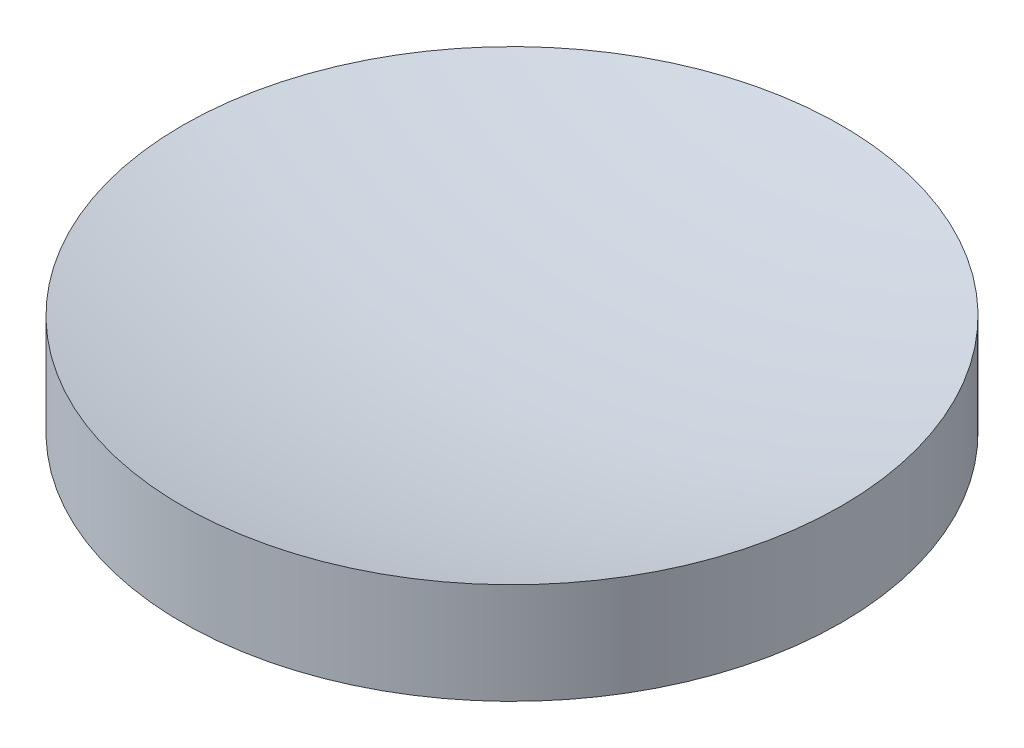
ISO-10303-21;
HEADER;
FILE_DESCRIPTION(('STEP AP214'),'2;1');
FILE_NAME('part.step','',(''),(''),'','','');
FILE_SCHEMA(('AUTOMOTIVE_DESIGN { 1 0 10303 214 1 1 1 1 }'));
ENDSEC;
DATA;
#1=APPLICATION_CONTEXT('core data for automotive mechanical design processes');
#2=APPLICATION_PROTOCOL_DEFINITION('international standard','automotive_design',2000,#1);
#3=PRODUCT_CONTEXT('',#1,'mechanical');
#4=PRODUCT('Part','Part','',(#3));
#5=PRODUCT_RELATED_PRODUCT_CATEGORY('part','',(#4));
#6=PRODUCT_DEFINITION_FORMATION('','',#4);
#7=PRODUCT_DEFINITION_CONTEXT('part definition',#1,'design');
#8=PRODUCT_DEFINITION('design','',#6,#7);
#9=PRODUCT_DEFINITION_SHAPE('','',#8);
#10=(LENGTH_UNIT() NAMED_UNIT(*) SI_UNIT(.MILLI.,.METRE.));
#11=(NAMED_UNIT(*) PLANE_ANGLE_UNIT() SI_UNIT($,.RADIAN.));
#12=(NAMED_UNIT(*) SI_UNIT($,.STERADIAN.) SOLID_ANGLE_UNIT());
#13=UNCERTAINTY_MEASURE_WITH_UNIT(LENGTH_MEASURE(1.E-05),#10,'distance_accuracy_value','');
#14=(GEOMETRIC_REPRESENTATION_CONTEXT(3) GLOBAL_UNCERTAINTY_ASSIGNED_CONTEXT((#13)) GLOBAL_UNIT_ASSIGNED_CONTEXT((#10,
#11,#12)) REPRESENTATION_CONTEXT('',''));
#15=CARTESIAN_POINT('',(0.,0.,0.));
#16=DIRECTION('',(0.,0.,1.));
#17=DIRECTION('',(1.,0.,0.));
#18=AXIS2_PLACEMENT_3D('',#15,#16,#17);
#19=CARTESIAN_POINT('',(0.,80.,0.));
#20=DIRECTION('',(0.,-1.,0.));
#21=DIRECTION('',(-1.,0.,0.));
#22=AXIS2_PLACEMENT_3D('',#19,#20,#21);
#23=SPHERICAL_SURFACE('',#22,80.);
#24=CARTESIAN_POINT('',(0.,2.54033307585167,0.));
#25=DIRECTION('',(0.,-1.,0.));
#26=DIRECTION('',(1.,0.,0.));
#27=AXIS2_PLACEMENT_3D('',#24,#25,#26);
#28=CIRCLE('',#27,20.);
#29=CARTESIAN_POINT('',(20.,2.54033307585167,0.));
#30=VERTEX_POINT('',#29);
#31=EDGE_CURVE('E10',#30,#30,#28,.T.);
#32=ORIENTED_EDGE('',*,*,#31,.F.);
#33=EDGE_LOOP('',(#32));
#34=FACE_BOUND('',#33,.T.);
#35=ADVANCED_FACE('F32',(#34),#23,.F.);
#36=CARTESIAN_POINT('',(0.,0.,0.));
#37=DIRECTION('',(0.,-1.,0.));
#38=DIRECTION('',(1.,0.,0.));
#39=AXIS2_PLACEMENT_3D('',#36,#37,#38);
#40=CYLINDRICAL_SURFACE('',#39,20.);
#41=CARTESIAN_POINT('',(0.,-3.59076668912918,0.));
#42=DIRECTION('',(0.,-1.,0.));
#43=DIRECTION('',(1.,0.,0.));
#44=AXIS2_PLACEMENT_3D('',#41,#42,#43);
#45=CIRCLE('',#44,20.);
#46=CARTESIAN_POINT('',(20.,-3.59076668912917,0.));
#47=VERTEX_POINT('',#46);
#48=EDGE_CURVE('E38',#47,#47,#45,.T.);
#49=ORIENTED_EDGE('',*,*,#48,.F.);
#50=EDGE_LOOP('',(#49));
#51=FACE_BOUND('',#50,.T.);
#52=ORIENTED_EDGE('',*,*,#31,.T.);
#53=EDGE_LOOP('',(#52));
#54=FACE_BOUND('',#53,.T.);
#55=ADVANCED_FACE('F46',(#51,#54),#40,.T.);
#56=CARTESIAN_POINT('',(0.,80.,0.));
#57=DIRECTION('',(0.,-1.,0.));
#58=DIRECTION('',(-1.,0.,0.));
#59=AXIS2_PLACEMENT_3D('',#56,#57,#58);
#60=SPHERICAL_SURFACE('',#59,85.9500801376964);
#61=ORIENTED_EDGE('',*,*,#48,.T.);
#62=EDGE_LOOP('',(#61));
#63=FACE_BOUND('',#62,.T.);
#64=ADVANCED_FACE('F44',(#63),#60,.T.);
#65=CLOSED_SHELL('',(#35,#55,#64));
#66=MANIFOLD_SOLID_BREP('B2',#65);
#67=ADVANCED_BREP_SHAPE_REPRESENTATION('',(#18,#66),#14);
#68=SHAPE_DEFINITION_REPRESENTATION(#9,#67);
ENDSEC;
END-ISO-10303-21;
